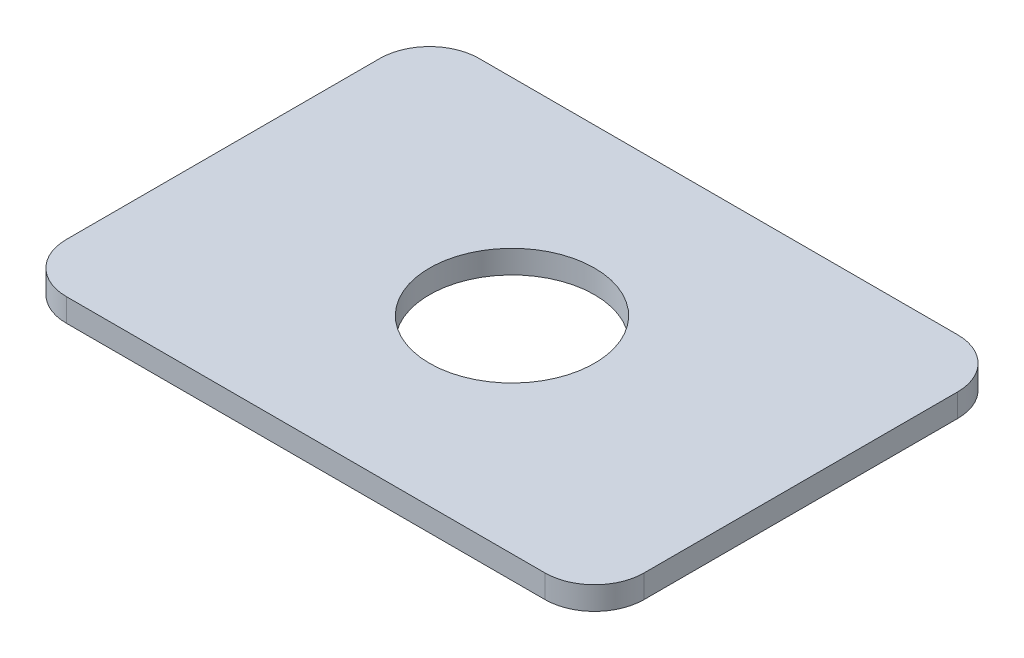
ISO-10303-21;
HEADER;
FILE_DESCRIPTION(('STEP AP214'),'2;1');
FILE_NAME('part.step','',(''),(''),'','','');
FILE_SCHEMA(('AUTOMOTIVE_DESIGN { 1 0 10303 214 1 1 1 1 }'));
ENDSEC;
DATA;
#1=APPLICATION_CONTEXT('core data for automotive mechanical design processes');
#2=APPLICATION_PROTOCOL_DEFINITION('international standard','automotive_design',2000,#1);
#3=PRODUCT_CONTEXT('',#1,'mechanical');
#4=PRODUCT('Part','Part','',(#3));
#5=PRODUCT_RELATED_PRODUCT_CATEGORY('part','',(#4));
#6=PRODUCT_DEFINITION_FORMATION('','',#4);
#7=PRODUCT_DEFINITION_CONTEXT('part definition',#1,'design');
#8=PRODUCT_DEFINITION('design','',#6,#7);
#9=PRODUCT_DEFINITION_SHAPE('','',#8);
#10=(LENGTH_UNIT() NAMED_UNIT(*) SI_UNIT(.MILLI.,.METRE.));
#11=(NAMED_UNIT(*) PLANE_ANGLE_UNIT() SI_UNIT($,.RADIAN.));
#12=(NAMED_UNIT(*) SI_UNIT($,.STERADIAN.) SOLID_ANGLE_UNIT());
#13=UNCERTAINTY_MEASURE_WITH_UNIT(LENGTH_MEASURE(1.E-05),#10,'distance_accuracy_value','');
#14=(GEOMETRIC_REPRESENTATION_CONTEXT(3) GLOBAL_UNCERTAINTY_ASSIGNED_CONTEXT((#13)) GLOBAL_UNIT_ASSIGNED_CONTEXT((#10,
#11,#12)) REPRESENTATION_CONTEXT('',''));
#15=CARTESIAN_POINT('',(0.,0.,0.));
#16=DIRECTION('',(0.,0.,1.));
#17=DIRECTION('',(1.,0.,0.));
#18=AXIS2_PLACEMENT_3D('',#15,#16,#17);
#19=CARTESIAN_POINT('',(17.5,1.4,12.5));
#20=DIRECTION('',(-1.,0.,0.));
#21=DIRECTION('',(0.,0.,1.));
#22=AXIS2_PLACEMENT_3D('',#19,#20,#21);
#23=PLANE('',#22);
#24=DIRECTION('',(0.,0.,-1.));
#25=VECTOR('',#24,1.);
#26=CARTESIAN_POINT('',(17.5,0.,12.5));
#27=LINE('',#26,#25);
#28=CARTESIAN_POINT('',(17.5,0.,9.5));
#29=VERTEX_POINT('',#28);
#30=CARTESIAN_POINT('',(17.5,0.,-9.5));
#31=VERTEX_POINT('',#30);
#32=EDGE_CURVE('E139',#29,#31,#27,.T.);
#33=ORIENTED_EDGE('',*,*,#32,.T.);
#34=DIRECTION('',(0.,-1.,0.));
#35=VECTOR('',#34,1.);
#36=CARTESIAN_POINT('',(17.5,1.4,-9.5));
#37=LINE('',#36,#35);
#38=CARTESIAN_POINT('',(17.5,1.4,-9.5));
#39=VERTEX_POINT('',#38);
#40=EDGE_CURVE('E11',#31,#39,#37,.F.);
#41=ORIENTED_EDGE('',*,*,#40,.T.);
#42=DIRECTION('',(0.,0.,-1.));
#43=VECTOR('',#42,1.);
#44=CARTESIAN_POINT('',(17.5,1.4,12.5));
#45=LINE('',#44,#43);
#46=CARTESIAN_POINT('',(17.5,1.4,9.5));
#47=VERTEX_POINT('',#46);
#48=EDGE_CURVE('E137',#47,#39,#45,.T.);
#49=ORIENTED_EDGE('',*,*,#48,.F.);
#50=DIRECTION('',(0.,-1.,0.));
#51=VECTOR('',#50,1.);
#52=CARTESIAN_POINT('',(17.5,1.4,9.5));
#53=LINE('',#52,#51);
#54=EDGE_CURVE('E51',#47,#29,#53,.T.);
#55=ORIENTED_EDGE('',*,*,#54,.T.);
#56=EDGE_LOOP('',(#33,#41,#49,#55));
#57=FACE_BOUND('',#56,.T.);
#58=ADVANCED_FACE('F43',(#57),#23,.F.);
#59=CARTESIAN_POINT('',(-17.5,1.4,-12.5));
#60=DIRECTION('',(0.,0.,1.));
#61=DIRECTION('',(1.,0.,0.));
#62=AXIS2_PLACEMENT_3D('',#59,#60,#61);
#63=PLANE('',#62);
#64=DIRECTION('',(-1.,0.,0.));
#65=VECTOR('',#64,1.);
#66=CARTESIAN_POINT('',(-17.5,0.,-12.5));
#67=LINE('',#66,#65);
#68=CARTESIAN_POINT('',(14.5,0.,-12.5));
#69=VERTEX_POINT('',#68);
#70=CARTESIAN_POINT('',(-14.5,0.,-12.5));
#71=VERTEX_POINT('',#70);
#72=EDGE_CURVE('E135',#69,#71,#67,.T.);
#73=ORIENTED_EDGE('',*,*,#72,.T.);
#74=DIRECTION('',(0.,-1.,0.));
#75=VECTOR('',#74,1.);
#76=CARTESIAN_POINT('',(-14.5,1.4,-12.5));
#77=LINE('',#76,#75);
#78=CARTESIAN_POINT('',(-14.5,1.4,-12.5));
#79=VERTEX_POINT('',#78);
#80=EDGE_CURVE('E114',#71,#79,#77,.F.);
#81=ORIENTED_EDGE('',*,*,#80,.T.);
#82=DIRECTION('',(-1.,0.,0.));
#83=VECTOR('',#82,1.);
#84=CARTESIAN_POINT('',(-17.5,1.4,-12.5));
#85=LINE('',#84,#83);
#86=CARTESIAN_POINT('',(14.5,1.4,-12.5));
#87=VERTEX_POINT('',#86);
#88=EDGE_CURVE('E179',#87,#79,#85,.T.);
#89=ORIENTED_EDGE('',*,*,#88,.F.);
#90=DIRECTION('',(0.,-1.,0.));
#91=VECTOR('',#90,1.);
#92=CARTESIAN_POINT('',(14.5,1.4,-12.5));
#93=LINE('',#92,#91);
#94=EDGE_CURVE('E119',#87,#69,#93,.T.);
#95=ORIENTED_EDGE('',*,*,#94,.T.);
#96=EDGE_LOOP('',(#73,#81,#89,#95));
#97=FACE_BOUND('',#96,.T.);
#98=ADVANCED_FACE('F196',(#97),#63,.F.);
#99=CARTESIAN_POINT('',(-17.5,1.4,12.5));
#100=DIRECTION('',(1.,0.,0.));
#101=DIRECTION('',(0.,0.,-1.));
#102=AXIS2_PLACEMENT_3D('',#99,#100,#101);
#103=PLANE('',#102);
#104=DIRECTION('',(0.,0.,1.));
#105=VECTOR('',#104,1.);
#106=CARTESIAN_POINT('',(-17.5,1.4,12.5));
#107=LINE('',#106,#105);
#108=CARTESIAN_POINT('',(-17.5,1.4,-9.5));
#109=VERTEX_POINT('',#108);
#110=CARTESIAN_POINT('',(-17.5,1.4,9.5));
#111=VERTEX_POINT('',#110);
#112=EDGE_CURVE('E128',#109,#111,#107,.T.);
#113=ORIENTED_EDGE('',*,*,#112,.F.);
#114=DIRECTION('',(0.,-1.,0.));
#115=VECTOR('',#114,1.);
#116=CARTESIAN_POINT('',(-17.5,1.4,-9.5));
#117=LINE('',#116,#115);
#118=CARTESIAN_POINT('',(-17.5,0.,-9.5));
#119=VERTEX_POINT('',#118);
#120=EDGE_CURVE('E113',#109,#119,#117,.T.);
#121=ORIENTED_EDGE('',*,*,#120,.T.);
#122=DIRECTION('',(0.,0.,1.));
#123=VECTOR('',#122,1.);
#124=CARTESIAN_POINT('',(-17.5,0.,12.5));
#125=LINE('',#124,#123);
#126=CARTESIAN_POINT('',(-17.5,0.,9.5));
#127=VERTEX_POINT('',#126);
#128=EDGE_CURVE('E126',#119,#127,#125,.T.);
#129=ORIENTED_EDGE('',*,*,#128,.T.);
#130=DIRECTION('',(0.,-1.,0.));
#131=VECTOR('',#130,1.);
#132=CARTESIAN_POINT('',(-17.5,1.4,9.5));
#133=LINE('',#132,#131);
#134=EDGE_CURVE('E130',#127,#111,#133,.F.);
#135=ORIENTED_EDGE('',*,*,#134,.T.);
#136=EDGE_LOOP('',(#113,#121,#129,#135));
#137=FACE_BOUND('',#136,.T.);
#138=ADVANCED_FACE('F125',(#137),#103,.F.);
#139=CARTESIAN_POINT('',(-17.5,1.4,12.5));
#140=DIRECTION('',(0.,0.,-1.));
#141=DIRECTION('',(-1.,0.,0.));
#142=AXIS2_PLACEMENT_3D('',#139,#140,#141);
#143=PLANE('',#142);
#144=DIRECTION('',(1.,0.,0.));
#145=VECTOR('',#144,1.);
#146=CARTESIAN_POINT('',(-17.5,1.4,12.5));
#147=LINE('',#146,#145);
#148=CARTESIAN_POINT('',(-14.5,1.4,12.5));
#149=VERTEX_POINT('',#148);
#150=CARTESIAN_POINT('',(14.5,1.4,12.5));
#151=VERTEX_POINT('',#150);
#152=EDGE_CURVE('E143',#149,#151,#147,.T.);
#153=ORIENTED_EDGE('',*,*,#152,.F.);
#154=DIRECTION('',(0.,-1.,0.));
#155=VECTOR('',#154,1.);
#156=CARTESIAN_POINT('',(-14.5,1.4,12.5));
#157=LINE('',#156,#155);
#158=CARTESIAN_POINT('',(-14.5,0.,12.5));
#159=VERTEX_POINT('',#158);
#160=EDGE_CURVE('E160',#149,#159,#157,.T.);
#161=ORIENTED_EDGE('',*,*,#160,.T.);
#162=DIRECTION('',(1.,0.,0.));
#163=VECTOR('',#162,1.);
#164=CARTESIAN_POINT('',(-17.5,0.,12.5));
#165=LINE('',#164,#163);
#166=CARTESIAN_POINT('',(14.5,0.,12.5));
#167=VERTEX_POINT('',#166);
#168=EDGE_CURVE('E134',#159,#167,#165,.T.);
#169=ORIENTED_EDGE('',*,*,#168,.T.);
#170=DIRECTION('',(0.,-1.,0.));
#171=VECTOR('',#170,1.);
#172=CARTESIAN_POINT('',(14.5,1.4,12.5));
#173=LINE('',#172,#171);
#174=EDGE_CURVE('E58',#167,#151,#173,.F.);
#175=ORIENTED_EDGE('',*,*,#174,.T.);
#176=EDGE_LOOP('',(#153,#161,#169,#175));
#177=FACE_BOUND('',#176,.T.);
#178=ADVANCED_FACE('F190',(#177),#143,.F.);
#179=CARTESIAN_POINT('',(0.,1.4,0.));
#180=DIRECTION('',(0.,-1.,0.));
#181=DIRECTION('',(0.,0.,-1.));
#182=AXIS2_PLACEMENT_3D('',#179,#180,#181);
#183=PLANE('',#182);
#184=CARTESIAN_POINT('',(0.,1.4,0.));
#185=DIRECTION('',(0.,1.,0.));
#186=DIRECTION('',(0.,0.,1.));
#187=AXIS2_PLACEMENT_3D('',#184,#185,#186);
#188=CIRCLE('',#187,5.);
#189=CARTESIAN_POINT('',(0.,1.4,5.));
#190=VERTEX_POINT('',#189);
#191=EDGE_CURVE('E174',#190,#190,#188,.T.);
#192=ORIENTED_EDGE('',*,*,#191,.F.);
#193=EDGE_LOOP('',(#192));
#194=FACE_BOUND('',#193,.T.);
#195=ORIENTED_EDGE('',*,*,#88,.T.);
#196=CARTESIAN_POINT('',(-14.5,1.4,-9.5));
#197=DIRECTION('',(0.,-1.,0.));
#198=DIRECTION('',(0.,0.,-1.));
#199=AXIS2_PLACEMENT_3D('',#196,#197,#198);
#200=CIRCLE('',#199,3.);
#201=EDGE_CURVE('E157',#79,#109,#200,.F.);
#202=ORIENTED_EDGE('',*,*,#201,.T.);
#203=ORIENTED_EDGE('',*,*,#112,.T.);
#204=CARTESIAN_POINT('',(-14.5,1.4,9.5));
#205=DIRECTION('',(0.,-1.,0.));
#206=DIRECTION('',(0.,0.,-1.));
#207=AXIS2_PLACEMENT_3D('',#204,#205,#206);
#208=CIRCLE('',#207,3.);
#209=EDGE_CURVE('E65',#111,#149,#208,.F.);
#210=ORIENTED_EDGE('',*,*,#209,.T.);
#211=ORIENTED_EDGE('',*,*,#152,.T.);
#212=CARTESIAN_POINT('',(14.5,1.4,9.5));
#213=DIRECTION('',(0.,-1.,0.));
#214=DIRECTION('',(0.,0.,-1.));
#215=AXIS2_PLACEMENT_3D('',#212,#213,#214);
#216=CIRCLE('',#215,3.);
#217=EDGE_CURVE('E152',#151,#47,#216,.F.);
#218=ORIENTED_EDGE('',*,*,#217,.T.);
#219=ORIENTED_EDGE('',*,*,#48,.T.);
#220=CARTESIAN_POINT('',(14.5,1.4,-9.5));
#221=DIRECTION('',(0.,-1.,0.));
#222=DIRECTION('',(0.,0.,-1.));
#223=AXIS2_PLACEMENT_3D('',#220,#221,#222);
#224=CIRCLE('',#223,3.);
#225=EDGE_CURVE('E154',#39,#87,#224,.F.);
#226=ORIENTED_EDGE('',*,*,#225,.T.);
#227=EDGE_LOOP('',(#195,#202,#203,#210,#211,#218,#219,#226));
#228=FACE_BOUND('',#227,.T.);
#229=ADVANCED_FACE('F188',(#194,#228),#183,.F.);
#230=CARTESIAN_POINT('',(0.,0.,0.));
#231=DIRECTION('',(0.,-1.,0.));
#232=DIRECTION('',(0.,0.,-1.));
#233=AXIS2_PLACEMENT_3D('',#230,#231,#232);
#234=PLANE('',#233);
#235=CARTESIAN_POINT('',(0.,0.,0.));
#236=DIRECTION('',(0.,1.,0.));
#237=DIRECTION('',(0.,0.,1.));
#238=AXIS2_PLACEMENT_3D('',#235,#236,#237);
#239=CIRCLE('',#238,5.);
#240=CARTESIAN_POINT('',(0.,0.,5.));
#241=VERTEX_POINT('',#240);
#242=EDGE_CURVE('E172',#241,#241,#239,.T.);
#243=ORIENTED_EDGE('',*,*,#242,.T.);
#244=EDGE_LOOP('',(#243));
#245=FACE_BOUND('',#244,.T.);
#246=ORIENTED_EDGE('',*,*,#128,.F.);
#247=CARTESIAN_POINT('',(-14.5,0.,-9.5));
#248=DIRECTION('',(0.,-1.,0.));
#249=DIRECTION('',(0.,0.,-1.));
#250=AXIS2_PLACEMENT_3D('',#247,#248,#249);
#251=CIRCLE('',#250,3.);
#252=EDGE_CURVE('E109',#119,#71,#251,.T.);
#253=ORIENTED_EDGE('',*,*,#252,.T.);
#254=ORIENTED_EDGE('',*,*,#72,.F.);
#255=CARTESIAN_POINT('',(14.5,0.,-9.5));
#256=DIRECTION('',(0.,-1.,0.));
#257=DIRECTION('',(0.,0.,-1.));
#258=AXIS2_PLACEMENT_3D('',#255,#256,#257);
#259=CIRCLE('',#258,3.);
#260=EDGE_CURVE('E146',#69,#31,#259,.T.);
#261=ORIENTED_EDGE('',*,*,#260,.T.);
#262=ORIENTED_EDGE('',*,*,#32,.F.);
#263=CARTESIAN_POINT('',(14.5,0.,9.5));
#264=DIRECTION('',(0.,-1.,0.));
#265=DIRECTION('',(0.,0.,-1.));
#266=AXIS2_PLACEMENT_3D('',#263,#264,#265);
#267=CIRCLE('',#266,3.);
#268=EDGE_CURVE('E129',#29,#167,#267,.T.);
#269=ORIENTED_EDGE('',*,*,#268,.T.);
#270=ORIENTED_EDGE('',*,*,#168,.F.);
#271=CARTESIAN_POINT('',(-14.5,0.,9.5));
#272=DIRECTION('',(0.,-1.,0.));
#273=DIRECTION('',(0.,0.,-1.));
#274=AXIS2_PLACEMENT_3D('',#271,#272,#273);
#275=CIRCLE('',#274,3.);
#276=EDGE_CURVE('E120',#159,#127,#275,.T.);
#277=ORIENTED_EDGE('',*,*,#276,.T.);
#278=EDGE_LOOP('',(#246,#253,#254,#261,#262,#269,#270,#277));
#279=FACE_BOUND('',#278,.T.);
#280=ADVANCED_FACE('F132',(#245,#279),#234,.T.);
#281=CARTESIAN_POINT('',(-14.5,1.4,-9.5));
#282=DIRECTION('',(0.,-1.,0.));
#283=DIRECTION('',(0.,0.,-1.));
#284=AXIS2_PLACEMENT_3D('',#281,#282,#283);
#285=CYLINDRICAL_SURFACE('',#284,3.);
#286=ORIENTED_EDGE('',*,*,#201,.F.);
#287=ORIENTED_EDGE('',*,*,#80,.F.);
#288=ORIENTED_EDGE('',*,*,#252,.F.);
#289=ORIENTED_EDGE('',*,*,#120,.F.);
#290=EDGE_LOOP('',(#286,#287,#288,#289));
#291=FACE_BOUND('',#290,.T.);
#292=ADVANCED_FACE('F112',(#291),#285,.T.);
#293=CARTESIAN_POINT('',(-14.5,1.4,9.5));
#294=DIRECTION('',(0.,-1.,0.));
#295=DIRECTION('',(0.,0.,-1.));
#296=AXIS2_PLACEMENT_3D('',#293,#294,#295);
#297=CYLINDRICAL_SURFACE('',#296,3.);
#298=ORIENTED_EDGE('',*,*,#209,.F.);
#299=ORIENTED_EDGE('',*,*,#134,.F.);
#300=ORIENTED_EDGE('',*,*,#276,.F.);
#301=ORIENTED_EDGE('',*,*,#160,.F.);
#302=EDGE_LOOP('',(#298,#299,#300,#301));
#303=FACE_BOUND('',#302,.T.);
#304=ADVANCED_FACE('F206',(#303),#297,.T.);
#305=CARTESIAN_POINT('',(14.5,1.4,-9.5));
#306=DIRECTION('',(0.,-1.,0.));
#307=DIRECTION('',(0.,0.,-1.));
#308=AXIS2_PLACEMENT_3D('',#305,#306,#307);
#309=CYLINDRICAL_SURFACE('',#308,3.);
#310=ORIENTED_EDGE('',*,*,#225,.F.);
#311=ORIENTED_EDGE('',*,*,#40,.F.);
#312=ORIENTED_EDGE('',*,*,#260,.F.);
#313=ORIENTED_EDGE('',*,*,#94,.F.);
#314=EDGE_LOOP('',(#310,#311,#312,#313));
#315=FACE_BOUND('',#314,.T.);
#316=ADVANCED_FACE('F198',(#315),#309,.T.);
#317=CARTESIAN_POINT('',(14.5,1.4,9.5));
#318=DIRECTION('',(0.,-1.,0.));
#319=DIRECTION('',(0.,0.,-1.));
#320=AXIS2_PLACEMENT_3D('',#317,#318,#319);
#321=CYLINDRICAL_SURFACE('',#320,3.);
#322=ORIENTED_EDGE('',*,*,#217,.F.);
#323=ORIENTED_EDGE('',*,*,#174,.F.);
#324=ORIENTED_EDGE('',*,*,#268,.F.);
#325=ORIENTED_EDGE('',*,*,#54,.F.);
#326=EDGE_LOOP('',(#322,#323,#324,#325));
#327=FACE_BOUND('',#326,.T.);
#328=ADVANCED_FACE('F45',(#327),#321,.T.);
#329=CARTESIAN_POINT('',(0.,0.,0.));
#330=DIRECTION('',(0.,1.,0.));
#331=DIRECTION('',(0.,0.,1.));
#332=AXIS2_PLACEMENT_3D('',#329,#330,#331);
#333=CYLINDRICAL_SURFACE('',#332,5.);
#334=ORIENTED_EDGE('',*,*,#242,.F.);
#335=EDGE_LOOP('',(#334));
#336=FACE_BOUND('',#335,.T.);
#337=ORIENTED_EDGE('',*,*,#191,.T.);
#338=EDGE_LOOP('',(#337));
#339=FACE_BOUND('',#338,.T.);
#340=ADVANCED_FACE('F186',(#336,#339),#333,.F.);
#341=CLOSED_SHELL('',(#58,#98,#138,#178,#229,#280,#292,#304,#316,#328,#340));
#342=MANIFOLD_SOLID_BREP('B2',#341);
#343=ADVANCED_BREP_SHAPE_REPRESENTATION('',(#18,#342),#14);
#344=SHAPE_DEFINITION_REPRESENTATION(#9,#343);
ENDSEC;
END-ISO-10303-21;
